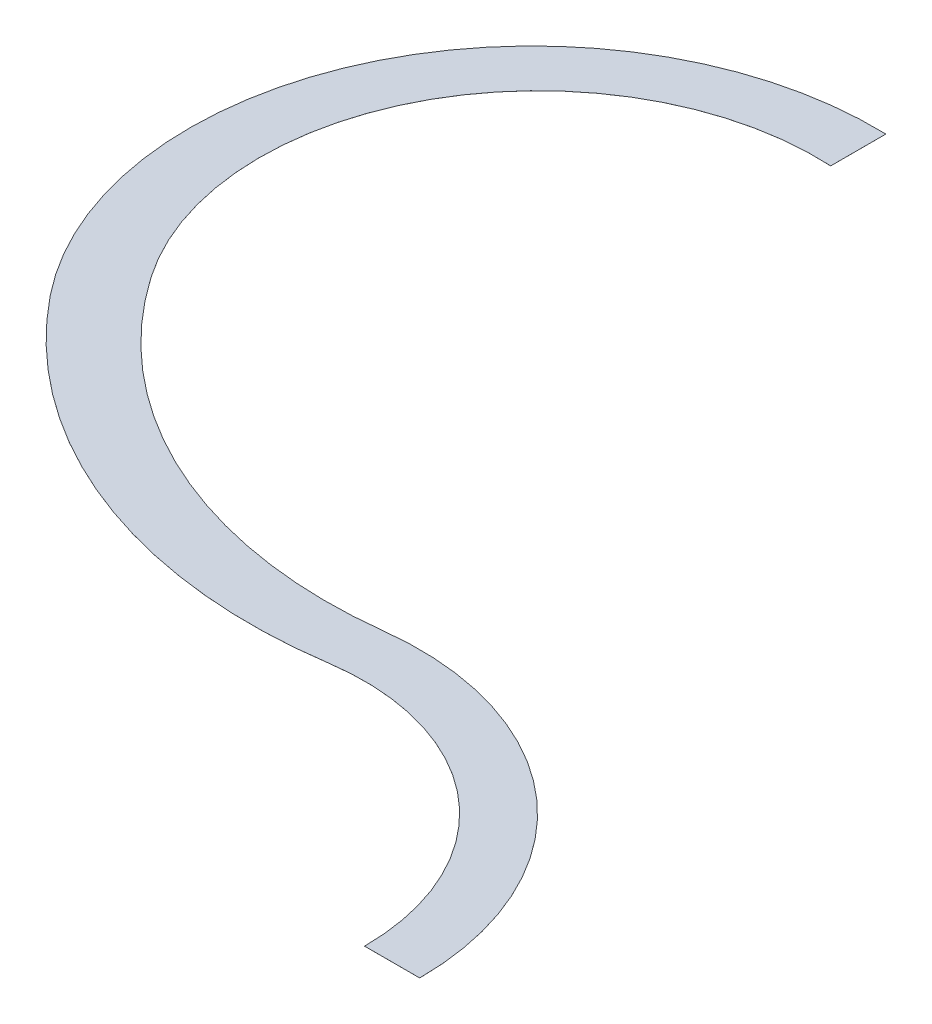
ISO-10303-21;
HEADER;
FILE_DESCRIPTION(('STEP AP214'),'2;1');
FILE_NAME('part.step','',(''),(''),'','','');
FILE_SCHEMA(('AUTOMOTIVE_DESIGN { 1 0 10303 214 1 1 1 1 }'));
ENDSEC;
DATA;
#1=APPLICATION_CONTEXT('core data for automotive mechanical design processes');
#2=APPLICATION_PROTOCOL_DEFINITION('international standard','automotive_design',2000,#1);
#3=PRODUCT_CONTEXT('',#1,'mechanical');
#4=PRODUCT('Part','Part','',(#3));
#5=PRODUCT_RELATED_PRODUCT_CATEGORY('part','',(#4));
#6=PRODUCT_DEFINITION_FORMATION('','',#4);
#7=PRODUCT_DEFINITION_CONTEXT('part definition',#1,'design');
#8=PRODUCT_DEFINITION('design','',#6,#7);
#9=PRODUCT_DEFINITION_SHAPE('','',#8);
#10=(LENGTH_UNIT() NAMED_UNIT(*) SI_UNIT(.MILLI.,.METRE.));
#11=(NAMED_UNIT(*) PLANE_ANGLE_UNIT() SI_UNIT($,.RADIAN.));
#12=(NAMED_UNIT(*) SI_UNIT($,.STERADIAN.) SOLID_ANGLE_UNIT());
#13=UNCERTAINTY_MEASURE_WITH_UNIT(LENGTH_MEASURE(1.E-05),#10,'distance_accuracy_value','');
#14=(GEOMETRIC_REPRESENTATION_CONTEXT(3) GLOBAL_UNCERTAINTY_ASSIGNED_CONTEXT((#13)) GLOBAL_UNIT_ASSIGNED_CONTEXT((#10,
#11,#12)) REPRESENTATION_CONTEXT('',''));
#15=CARTESIAN_POINT('',(0.,0.,0.));
#16=DIRECTION('',(0.,0.,1.));
#17=DIRECTION('',(1.,0.,0.));
#18=AXIS2_PLACEMENT_3D('',#15,#16,#17);
#19=CARTESIAN_POINT('',(387.775623229675,0.01,-763.032639238751));
#20=DIRECTION('',(0.,-1.,0.));
#21=DIRECTION('',(0.,0.,-1.));
#22=AXIS2_PLACEMENT_3D('',#19,#20,#21);
#23=CYLINDRICAL_SURFACE('',#22,83.2913325168592);
#24=CARTESIAN_POINT('',(387.775623229675,0.,-763.032639238751));
#25=DIRECTION('',(0.,1.,0.));
#26=DIRECTION('',(0.,0.,1.));
#27=AXIS2_PLACEMENT_3D('',#24,#25,#26);
#28=CIRCLE('',#27,83.2913325168592);
#29=CARTESIAN_POINT('',(471.066955746535,0.,-763.03263923875));
#30=VERTEX_POINT('',#29);
#31=CARTESIAN_POINT('',(375.530369993733,0.,-845.418923568253));
#32=VERTEX_POINT('',#31);
#33=EDGE_CURVE('E143',#30,#32,#28,.T.);
#34=ORIENTED_EDGE('',*,*,#33,.F.);
#35=DIRECTION('',(0.,-1.,0.));
#36=VECTOR('',#35,1.);
#37=CARTESIAN_POINT('',(471.066955746535,0.01,-763.03263923875));
#38=LINE('',#37,#36);
#39=CARTESIAN_POINT('',(471.066955746535,0.01,-763.03263923875));
#40=VERTEX_POINT('',#39);
#41=EDGE_CURVE('E11',#40,#30,#38,.T.);
#42=ORIENTED_EDGE('',*,*,#41,.F.);
#43=CARTESIAN_POINT('',(387.775623229675,0.01,-763.032639238751));
#44=DIRECTION('',(0.,1.,0.));
#45=DIRECTION('',(0.,0.,1.));
#46=AXIS2_PLACEMENT_3D('',#43,#44,#45);
#47=CIRCLE('',#46,83.2913325168592);
#48=CARTESIAN_POINT('',(375.530369993733,0.01,-845.418923568253));
#49=VERTEX_POINT('',#48);
#50=EDGE_CURVE('E168',#40,#49,#47,.T.);
#51=ORIENTED_EDGE('',*,*,#50,.T.);
#52=DIRECTION('',(0.,-1.,0.));
#53=VECTOR('',#52,1.);
#54=CARTESIAN_POINT('',(375.530369993733,0.01,-845.418923568253));
#55=LINE('',#54,#53);
#56=EDGE_CURVE('E42',#49,#32,#55,.T.);
#57=ORIENTED_EDGE('',*,*,#56,.T.);
#58=EDGE_LOOP('',(#34,#42,#51,#57));
#59=FACE_BOUND('',#58,.T.);
#60=ADVANCED_FACE('F39',(#59),#23,.F.);
#61=CARTESIAN_POINT('',(471.066955746535,0.01,-763.03263923875));
#62=DIRECTION('',(0.,0.,-1.));
#63=DIRECTION('',(-1.,0.,0.));
#64=AXIS2_PLACEMENT_3D('',#61,#62,#63);
#65=PLANE('',#64);
#66=DIRECTION('',(1.,0.,0.));
#67=VECTOR('',#66,1.);
#68=CARTESIAN_POINT('',(471.066955746535,0.,-763.03263923875));
#69=LINE('',#68,#67);
#70=CARTESIAN_POINT('',(491.066955746534,0.,-763.03263923875));
#71=VERTEX_POINT('',#70);
#72=EDGE_CURVE('E85',#30,#71,#69,.T.);
#73=ORIENTED_EDGE('',*,*,#72,.T.);
#74=DIRECTION('',(0.,-1.,0.));
#75=VECTOR('',#74,1.);
#76=CARTESIAN_POINT('',(491.066955746534,0.01,-763.03263923875));
#77=LINE('',#76,#75);
#78=CARTESIAN_POINT('',(491.066955746534,0.01,-763.03263923875));
#79=VERTEX_POINT('',#78);
#80=EDGE_CURVE('E49',#79,#71,#77,.T.);
#81=ORIENTED_EDGE('',*,*,#80,.F.);
#82=DIRECTION('',(1.,0.,0.));
#83=VECTOR('',#82,1.);
#84=CARTESIAN_POINT('',(471.066955746535,0.01,-763.03263923875));
#85=LINE('',#84,#83);
#86=EDGE_CURVE('E116',#40,#79,#85,.T.);
#87=ORIENTED_EDGE('',*,*,#86,.F.);
#88=ORIENTED_EDGE('',*,*,#41,.T.);
#89=EDGE_LOOP('',(#73,#81,#87,#88));
#90=FACE_BOUND('',#89,.T.);
#91=ADVANCED_FACE('F217',(#90),#65,.F.);
#92=CARTESIAN_POINT('',(387.863090769459,0.01,-763.032639238751));
#93=DIRECTION('',(0.,-1.,0.));
#94=DIRECTION('',(0.,0.,-1.));
#95=AXIS2_PLACEMENT_3D('',#92,#93,#94);
#96=CYLINDRICAL_SURFACE('',#95,103.203864977075);
#97=CARTESIAN_POINT('',(387.863090769459,0.,-763.032639238751));
#98=DIRECTION('',(0.,1.,0.));
#99=DIRECTION('',(0.,0.,1.));
#100=AXIS2_PLACEMENT_3D('',#97,#98,#99);
#101=CIRCLE('',#100,103.203864977075);
#102=CARTESIAN_POINT('',(375.530369993733,0.,-865.496983010008));
#103=VERTEX_POINT('',#102);
#104=EDGE_CURVE('E124',#71,#103,#101,.T.);
#105=ORIENTED_EDGE('',*,*,#104,.T.);
#106=DIRECTION('',(0.,-1.,0.));
#107=VECTOR('',#106,1.);
#108=CARTESIAN_POINT('',(375.530369993733,0.01,-865.496983010008));
#109=LINE('',#108,#107);
#110=CARTESIAN_POINT('',(375.530369993733,0.01,-865.496983010008));
#111=VERTEX_POINT('',#110);
#112=EDGE_CURVE('E121',#111,#103,#109,.T.);
#113=ORIENTED_EDGE('',*,*,#112,.F.);
#114=CARTESIAN_POINT('',(387.863090769459,0.01,-763.032639238751));
#115=DIRECTION('',(0.,1.,0.));
#116=DIRECTION('',(0.,0.,1.));
#117=AXIS2_PLACEMENT_3D('',#114,#115,#116);
#118=CIRCLE('',#117,103.203864977075);
#119=EDGE_CURVE('E109',#79,#111,#118,.T.);
#120=ORIENTED_EDGE('',*,*,#119,.F.);
#121=ORIENTED_EDGE('',*,*,#80,.T.);
#122=EDGE_LOOP('',(#105,#113,#120,#121));
#123=FACE_BOUND('',#122,.T.);
#124=ADVANCED_FACE('F122',(#123),#96,.T.);
#125=CARTESIAN_POINT('',(356.067427345317,0.01,-1027.20158028367));
#126=DIRECTION('',(0.,-1.,0.));
#127=DIRECTION('',(0.,0.,-1.));
#128=AXIS2_PLACEMENT_3D('',#125,#126,#127);
#129=CYLINDRICAL_SURFACE('',#128,162.871676223871);
#130=CARTESIAN_POINT('',(356.067427345317,0.,-1027.20158028367));
#131=DIRECTION('',(0.,-1.,0.));
#132=DIRECTION('',(0.,0.,-1.));
#133=AXIS2_PLACEMENT_3D('',#130,#131,#132);
#134=CIRCLE('',#133,162.871676223871);
#135=CARTESIAN_POINT('',(222.246119014636,0.,-934.362793385964));
#136=VERTEX_POINT('',#135);
#137=EDGE_CURVE('E162',#103,#136,#134,.T.);
#138=ORIENTED_EDGE('',*,*,#137,.T.);
#139=DIRECTION('',(0.,-1.,0.));
#140=VECTOR('',#139,1.);
#141=CARTESIAN_POINT('',(222.246119014636,0.01,-934.362793385964));
#142=LINE('',#141,#140);
#143=CARTESIAN_POINT('',(222.246119014636,0.01,-934.362793385964));
#144=VERTEX_POINT('',#143);
#145=EDGE_CURVE('E128',#144,#136,#142,.T.);
#146=ORIENTED_EDGE('',*,*,#145,.F.);
#147=CARTESIAN_POINT('',(356.067427345317,0.01,-1027.20158028367));
#148=DIRECTION('',(0.,-1.,0.));
#149=DIRECTION('',(0.,0.,-1.));
#150=AXIS2_PLACEMENT_3D('',#147,#148,#149);
#151=CIRCLE('',#150,162.871676223871);
#152=EDGE_CURVE('E114',#111,#144,#151,.T.);
#153=ORIENTED_EDGE('',*,*,#152,.F.);
#154=ORIENTED_EDGE('',*,*,#112,.T.);
#155=EDGE_LOOP('',(#138,#146,#153,#154));
#156=FACE_BOUND('',#155,.T.);
#157=ADVANCED_FACE('F130',(#156),#129,.F.);
#158=CARTESIAN_POINT('',(305.190913806114,0.01,-991.905902357012));
#159=DIRECTION('',(0.,-1.,0.));
#160=DIRECTION('',(0.,0.,-1.));
#161=AXIS2_PLACEMENT_3D('',#158,#159,#160);
#162=CYLINDRICAL_SURFACE('',#161,100.950722498922);
#163=CARTESIAN_POINT('',(305.190913806114,0.,-991.905902357012));
#164=DIRECTION('',(0.,-1.,0.));
#165=DIRECTION('',(0.,0.,-1.));
#166=AXIS2_PLACEMENT_3D('',#163,#164,#165);
#167=CIRCLE('',#166,100.950722498922);
#168=CARTESIAN_POINT('',(310.481176611029,0.,-1092.71791301303));
#169=VERTEX_POINT('',#168);
#170=EDGE_CURVE('E159',#136,#169,#167,.T.);
#171=ORIENTED_EDGE('',*,*,#170,.T.);
#172=DIRECTION('',(0.,-1.,0.));
#173=VECTOR('',#172,1.);
#174=CARTESIAN_POINT('',(310.481176611029,0.01,-1092.71791301303));
#175=LINE('',#174,#173);
#176=CARTESIAN_POINT('',(310.481176611029,0.01,-1092.71791301303));
#177=VERTEX_POINT('',#176);
#178=EDGE_CURVE('E174',#177,#169,#175,.T.);
#179=ORIENTED_EDGE('',*,*,#178,.F.);
#180=CARTESIAN_POINT('',(305.190913806114,0.01,-991.905902357012));
#181=DIRECTION('',(0.,-1.,0.));
#182=DIRECTION('',(0.,0.,-1.));
#183=AXIS2_PLACEMENT_3D('',#180,#181,#182);
#184=CIRCLE('',#183,100.950722498922);
#185=EDGE_CURVE('E134',#144,#177,#184,.T.);
#186=ORIENTED_EDGE('',*,*,#185,.F.);
#187=ORIENTED_EDGE('',*,*,#145,.T.);
#188=EDGE_LOOP('',(#171,#179,#186,#187));
#189=FACE_BOUND('',#188,.T.);
#190=ADVANCED_FACE('F190',(#189),#162,.F.);
#191=CARTESIAN_POINT('',(310.481176611029,0.01,-1092.71791301303));
#192=DIRECTION('',(-1.,0.,0.));
#193=DIRECTION('',(0.,0.,1.));
#194=AXIS2_PLACEMENT_3D('',#191,#192,#193);
#195=PLANE('',#194);
#196=DIRECTION('',(0.,0.,-1.));
#197=VECTOR('',#196,1.);
#198=CARTESIAN_POINT('',(310.481176611029,0.,-1092.71791301303));
#199=LINE('',#198,#197);
#200=CARTESIAN_POINT('',(310.481176611029,0.,-1112.71791301303));
#201=VERTEX_POINT('',#200);
#202=EDGE_CURVE('E155',#169,#201,#199,.T.);
#203=ORIENTED_EDGE('',*,*,#202,.T.);
#204=DIRECTION('',(0.,-1.,0.));
#205=VECTOR('',#204,1.);
#206=CARTESIAN_POINT('',(310.481176611029,0.01,-1112.71791301303));
#207=LINE('',#206,#205);
#208=CARTESIAN_POINT('',(310.481176611029,0.01,-1112.71791301303));
#209=VERTEX_POINT('',#208);
#210=EDGE_CURVE('E178',#209,#201,#207,.T.);
#211=ORIENTED_EDGE('',*,*,#210,.F.);
#212=DIRECTION('',(0.,0.,-1.));
#213=VECTOR('',#212,1.);
#214=CARTESIAN_POINT('',(310.481176611029,0.01,-1092.71791301303));
#215=LINE('',#214,#213);
#216=EDGE_CURVE('E137',#177,#209,#215,.T.);
#217=ORIENTED_EDGE('',*,*,#216,.F.);
#218=ORIENTED_EDGE('',*,*,#178,.T.);
#219=EDGE_LOOP('',(#203,#211,#217,#218));
#220=FACE_BOUND('',#219,.T.);
#221=ADVANCED_FACE('F199',(#220),#195,.F.);
#222=CARTESIAN_POINT('',(306.739150433938,0.01,-988.301592958937));
#223=DIRECTION('',(0.,-1.,0.));
#224=DIRECTION('',(0.,0.,-1.));
#225=AXIS2_PLACEMENT_3D('',#222,#223,#224);
#226=CYLINDRICAL_SURFACE('',#225,124.472581140238);
#227=CARTESIAN_POINT('',(306.739150433938,0.,-988.301592958937));
#228=DIRECTION('',(0.,-1.,0.));
#229=DIRECTION('',(0.,0.,-1.));
#230=AXIS2_PLACEMENT_3D('',#227,#228,#229);
#231=CIRCLE('',#230,124.472581140238);
#232=CARTESIAN_POINT('',(209.725811714252,0.,-910.315468768972));
#233=VERTEX_POINT('',#232);
#234=EDGE_CURVE('E151',#233,#201,#231,.T.);
#235=ORIENTED_EDGE('',*,*,#234,.F.);
#236=DIRECTION('',(0.,-1.,0.));
#237=VECTOR('',#236,1.);
#238=CARTESIAN_POINT('',(209.725811714252,0.01,-910.315468768972));
#239=LINE('',#238,#237);
#240=CARTESIAN_POINT('',(209.725811714252,0.01,-910.315468768972));
#241=VERTEX_POINT('',#240);
#242=EDGE_CURVE('E180',#241,#233,#239,.T.);
#243=ORIENTED_EDGE('',*,*,#242,.F.);
#244=CARTESIAN_POINT('',(306.739150433938,0.01,-988.301592958937));
#245=DIRECTION('',(0.,-1.,0.));
#246=DIRECTION('',(0.,0.,-1.));
#247=AXIS2_PLACEMENT_3D('',#244,#245,#246);
#248=CIRCLE('',#247,124.472581140238);
#249=EDGE_CURVE('E196',#241,#209,#248,.T.);
#250=ORIENTED_EDGE('',*,*,#249,.T.);
#251=ORIENTED_EDGE('',*,*,#210,.T.);
#252=EDGE_LOOP('',(#235,#243,#250,#251));
#253=FACE_BOUND('',#252,.T.);
#254=ADVANCED_FACE('F201',(#253),#226,.T.);
#255=CARTESIAN_POINT('',(349.217993624599,0.01,-1022.44906571096));
#256=DIRECTION('',(0.,-1.,0.));
#257=DIRECTION('',(0.,0.,-1.));
#258=AXIS2_PLACEMENT_3D('',#255,#256,#257);
#259=CYLINDRICAL_SURFACE('',#258,178.974893147773);
#260=CARTESIAN_POINT('',(349.217993624599,0.,-1022.44906571096));
#261=DIRECTION('',(0.,-1.,0.));
#262=DIRECTION('',(0.,0.,-1.));
#263=AXIS2_PLACEMENT_3D('',#260,#261,#262);
#264=CIRCLE('',#263,178.974893147773);
#265=EDGE_CURVE('E147',#32,#233,#264,.T.);
#266=ORIENTED_EDGE('',*,*,#265,.F.);
#267=ORIENTED_EDGE('',*,*,#56,.F.);
#268=CARTESIAN_POINT('',(349.217993624599,0.01,-1022.44906571096));
#269=DIRECTION('',(0.,-1.,0.));
#270=DIRECTION('',(0.,0.,-1.));
#271=AXIS2_PLACEMENT_3D('',#268,#269,#270);
#272=CIRCLE('',#271,178.974893147773);
#273=EDGE_CURVE('E203',#49,#241,#272,.T.);
#274=ORIENTED_EDGE('',*,*,#273,.T.);
#275=ORIENTED_EDGE('',*,*,#242,.T.);
#276=EDGE_LOOP('',(#266,#267,#274,#275));
#277=FACE_BOUND('',#276,.T.);
#278=ADVANCED_FACE('F184',(#277),#259,.T.);
#279=CARTESIAN_POINT('',(387.775623229675,0.01,-763.032639238751));
#280=DIRECTION('',(0.,1.,0.));
#281=DIRECTION('',(0.,0.,1.));
#282=AXIS2_PLACEMENT_3D('',#279,#280,#281);
#283=PLANE('',#282);
#284=ORIENTED_EDGE('',*,*,#50,.F.);
#285=ORIENTED_EDGE('',*,*,#86,.T.);
#286=ORIENTED_EDGE('',*,*,#119,.T.);
#287=ORIENTED_EDGE('',*,*,#152,.T.);
#288=ORIENTED_EDGE('',*,*,#185,.T.);
#289=ORIENTED_EDGE('',*,*,#216,.T.);
#290=ORIENTED_EDGE('',*,*,#249,.F.);
#291=ORIENTED_EDGE('',*,*,#273,.F.);
#292=EDGE_LOOP('',(#284,#285,#286,#287,#288,#289,#290,#291));
#293=FACE_BOUND('',#292,.T.);
#294=ADVANCED_FACE('F112',(#293),#283,.T.);
#295=CARTESIAN_POINT('',(387.775623229675,0.,-763.032639238751));
#296=DIRECTION('',(0.,1.,0.));
#297=DIRECTION('',(0.,0.,1.));
#298=AXIS2_PLACEMENT_3D('',#295,#296,#297);
#299=PLANE('',#298);
#300=ORIENTED_EDGE('',*,*,#33,.T.);
#301=ORIENTED_EDGE('',*,*,#265,.T.);
#302=ORIENTED_EDGE('',*,*,#234,.T.);
#303=ORIENTED_EDGE('',*,*,#202,.F.);
#304=ORIENTED_EDGE('',*,*,#170,.F.);
#305=ORIENTED_EDGE('',*,*,#137,.F.);
#306=ORIENTED_EDGE('',*,*,#104,.F.);
#307=ORIENTED_EDGE('',*,*,#72,.F.);
#308=EDGE_LOOP('',(#300,#301,#302,#303,#304,#305,#306,#307));
#309=FACE_BOUND('',#308,.T.);
#310=ADVANCED_FACE('F186',(#309),#299,.F.);
#311=CLOSED_SHELL('',(#60,#91,#124,#157,#190,#221,#254,#278,#294,#310));
#312=MANIFOLD_SOLID_BREP('B2',#311);
#313=ADVANCED_BREP_SHAPE_REPRESENTATION('',(#18,#312),#14);
#314=SHAPE_DEFINITION_REPRESENTATION(#9,#313);
ENDSEC;
END-ISO-10303-21;
